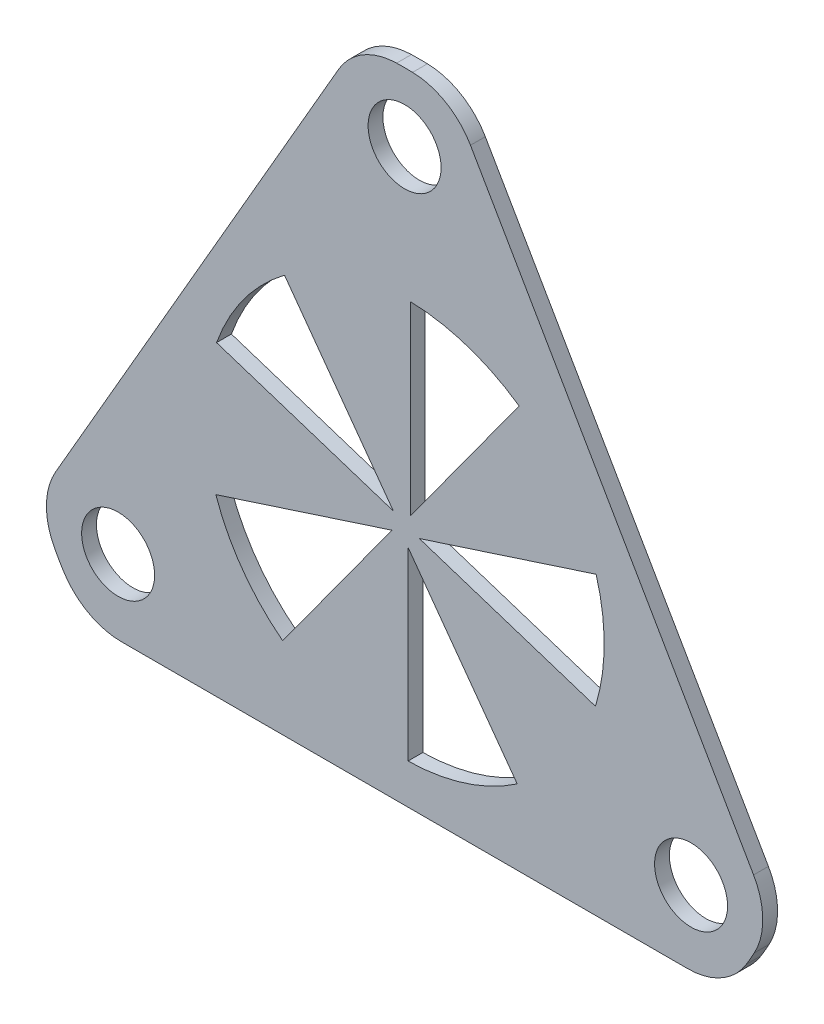
ISO-10303-21;
HEADER;
FILE_DESCRIPTION(('STEP AP214'),'2;1');
FILE_NAME('part.step','',(''),(''),'','','');
FILE_SCHEMA(('AUTOMOTIVE_DESIGN { 1 0 10303 214 1 1 1 1 }'));
ENDSEC;
DATA;
#1=APPLICATION_CONTEXT('core data for automotive mechanical design processes');
#2=APPLICATION_PROTOCOL_DEFINITION('international standard','automotive_design',2000,#1);
#3=PRODUCT_CONTEXT('',#1,'mechanical');
#4=PRODUCT('Part','Part','',(#3));
#5=PRODUCT_RELATED_PRODUCT_CATEGORY('part','',(#4));
#6=PRODUCT_DEFINITION_FORMATION('','',#4);
#7=PRODUCT_DEFINITION_CONTEXT('part definition',#1,'design');
#8=PRODUCT_DEFINITION('design','',#6,#7);
#9=PRODUCT_DEFINITION_SHAPE('','',#8);
#10=(LENGTH_UNIT() NAMED_UNIT(*) SI_UNIT(.MILLI.,.METRE.));
#11=(NAMED_UNIT(*) PLANE_ANGLE_UNIT() SI_UNIT($,.RADIAN.));
#12=(NAMED_UNIT(*) SI_UNIT($,.STERADIAN.) SOLID_ANGLE_UNIT());
#13=UNCERTAINTY_MEASURE_WITH_UNIT(LENGTH_MEASURE(1.E-05),#10,'distance_accuracy_value','');
#14=(GEOMETRIC_REPRESENTATION_CONTEXT(3) GLOBAL_UNCERTAINTY_ASSIGNED_CONTEXT((#13)) GLOBAL_UNIT_ASSIGNED_CONTEXT((#10,
#11,#12)) REPRESENTATION_CONTEXT('',''));
#15=CARTESIAN_POINT('',(0.,0.,0.));
#16=DIRECTION('',(0.,0.,1.));
#17=DIRECTION('',(1.,0.,0.));
#18=AXIS2_PLACEMENT_3D('',#15,#16,#17);
#19=CARTESIAN_POINT('',(0.,0.,8.7));
#20=DIRECTION('',(0.,0.,1.));
#21=DIRECTION('',(1.,0.,0.));
#22=AXIS2_PLACEMENT_3D('',#19,#20,#21);
#23=PLANE('',#22);
#24=CARTESIAN_POINT('',(0.,29.,8.7));
#25=DIRECTION('',(0.,0.,-1.));
#26=DIRECTION('',(-1.,0.,0.));
#27=AXIS2_PLACEMENT_3D('',#24,#25,#26);
#28=CIRCLE('',#27,3.2);
#29=CARTESIAN_POINT('',(-3.2,29.,8.7));
#30=VERTEX_POINT('',#29);
#31=EDGE_CURVE('E399',#30,#30,#28,.T.);
#32=ORIENTED_EDGE('',*,*,#31,.F.);
#33=EDGE_LOOP('',(#32));
#34=FACE_BOUND('',#33,.T.);
#35=CARTESIAN_POINT('',(-25.1147367097503,-14.4999999999991,8.7));
#36=DIRECTION('',(0.,0.,-1.));
#37=DIRECTION('',(-1.,0.,0.));
#38=AXIS2_PLACEMENT_3D('',#35,#36,#37);
#39=CIRCLE('',#38,3.2);
#40=CARTESIAN_POINT('',(-28.3147367097503,-14.4999999999991,8.7));
#41=VERTEX_POINT('',#40);
#42=EDGE_CURVE('E913',#41,#41,#39,.T.);
#43=ORIENTED_EDGE('',*,*,#42,.F.);
#44=EDGE_LOOP('',(#43));
#45=FACE_BOUND('',#44,.T.);
#46=CARTESIAN_POINT('',(25.1147367097471,-14.5000000000009,8.7));
#47=DIRECTION('',(0.,0.,-1.));
#48=DIRECTION('',(-1.,0.,0.));
#49=AXIS2_PLACEMENT_3D('',#46,#47,#48);
#50=CIRCLE('',#49,3.2);
#51=CARTESIAN_POINT('',(21.9147367097471,-14.5000000000009,8.7));
#52=VERTEX_POINT('',#51);
#53=EDGE_CURVE('E416',#52,#52,#50,.T.);
#54=ORIENTED_EDGE('',*,*,#53,.F.);
#55=EDGE_LOOP('',(#54));
#56=FACE_BOUND('',#55,.T.);
#57=DIRECTION('',(-0.587785252292473,-0.809016994374947,0.));
#58=VECTOR('',#57,1.);
#59=CARTESIAN_POINT('',(-0.242705098312483,0.176335575687741,8.7));
#60=LINE('',#59,#58);
#61=CARTESIAN_POINT('',(10.0420252579527,14.3320524949722,8.7));
#62=VERTEX_POINT('',#61);
#63=CARTESIAN_POINT('',(0.5,1.19858144524681,8.7));
#64=VERTEX_POINT('',#63);
#65=EDGE_CURVE('E276',#62,#64,#60,.T.);
#66=ORIENTED_EDGE('',*,*,#65,.F.);
#67=CARTESIAN_POINT('',(0.,0.,8.7));
#68=DIRECTION('',(0.,0.,1.));
#69=DIRECTION('',(1.,0.,0.));
#70=AXIS2_PLACEMENT_3D('',#67,#68,#69);
#71=CIRCLE('',#70,17.5);
#72=CARTESIAN_POINT('',(0.5,17.4928556845359,8.7));
#73=VERTEX_POINT('',#72);
#74=EDGE_CURVE('E230',#62,#73,#71,.T.);
#75=ORIENTED_EDGE('',*,*,#74,.T.);
#76=DIRECTION('',(0.,1.,0.));
#77=VECTOR('',#76,1.);
#78=CARTESIAN_POINT('',(0.5,0.,8.7));
#79=LINE('',#78,#77);
#80=EDGE_CURVE('E279',#64,#73,#79,.T.);
#81=ORIENTED_EDGE('',*,*,#80,.F.);
#82=EDGE_LOOP('',(#66,#75,#81));
#83=FACE_BOUND('',#82,.T.);
#84=CARTESIAN_POINT('',(0.,0.,8.7));
#85=DIRECTION('',(0.,0.,1.));
#86=DIRECTION('',(1.,0.,0.));
#87=AXIS2_PLACEMENT_3D('',#84,#85,#86);
#88=CIRCLE('',#87,17.5);
#89=CARTESIAN_POINT('',(16.7337483798774,-5.12168577315618,8.7));
#90=VERTEX_POINT('',#89);
#91=CARTESIAN_POINT('',(16.7912028845761,4.93006142852242,8.7));
#92=VERTEX_POINT('',#91);
#93=EDGE_CURVE('E268',#90,#92,#88,.T.);
#94=ORIENTED_EDGE('',*,*,#93,.T.);
#95=DIRECTION('',(0.951056516295154,0.309016994374948,0.));
#96=VECTOR('',#95,1.);
#97=CARTESIAN_POINT('',(0.154508497187474,-0.475528258147577,8.7));
#98=LINE('',#97,#96);
#99=CARTESIAN_POINT('',(1.29442719099992,-0.105146222423827,8.7));
#100=VERTEX_POINT('',#99);
#101=EDGE_CURVE('E273',#100,#92,#98,.T.);
#102=ORIENTED_EDGE('',*,*,#101,.F.);
#103=DIRECTION('',(-0.951056516295154,0.309016994374948,0.));
#104=VECTOR('',#103,1.);
#105=CARTESIAN_POINT('',(0.0927050983124842,0.285316954888546,8.7));
#106=LINE('',#105,#104);
#107=EDGE_CURVE('E270',#90,#100,#106,.T.);
#108=ORIENTED_EDGE('',*,*,#107,.F.);
#109=EDGE_LOOP('',(#94,#102,#108));
#110=FACE_BOUND('',#109,.T.);
#111=DIRECTION('',(0.587785252292473,-0.809016994374947,0.));
#112=VECTOR('',#111,1.);
#113=CARTESIAN_POINT('',(-0.242705098312484,-0.176335575687742,8.7));
#114=LINE('',#113,#112);
#115=CARTESIAN_POINT('',(-10.5274354545777,13.9793813435967,8.7));
#116=VERTEX_POINT('',#115);
#117=CARTESIAN_POINT('',(-0.985410196624968,0.845910293871327,8.7));
#118=VERTEX_POINT('',#117);
#119=EDGE_CURVE('E260',#116,#118,#114,.T.);
#120=ORIENTED_EDGE('',*,*,#119,.F.);
#121=CARTESIAN_POINT('',(0.,0.,8.7));
#122=DIRECTION('',(0.,0.,1.));
#123=DIRECTION('',(1.,0.,0.));
#124=AXIS2_PLACEMENT_3D('',#121,#122,#123);
#125=CIRCLE('',#124,17.5);
#126=CARTESIAN_POINT('',(-16.4821858902011,5.88111794481757,8.7));
#127=VERTEX_POINT('',#126);
#128=EDGE_CURVE('E266',#116,#127,#125,.T.);
#129=ORIENTED_EDGE('',*,*,#128,.T.);
#130=DIRECTION('',(-0.951056516295154,0.309016994374947,0.));
#131=VECTOR('',#130,1.);
#132=CARTESIAN_POINT('',(0.154508497187474,0.475528258147577,8.7));
#133=LINE('',#132,#131);
#134=EDGE_CURVE('E263',#118,#127,#133,.T.);
#135=ORIENTED_EDGE('',*,*,#134,.F.);
#136=EDGE_LOOP('',(#120,#129,#135));
#137=FACE_BOUND('',#136,.T.);
#138=DIRECTION('',(0.951056516295154,0.309016994374948,0.));
#139=VECTOR('',#138,1.);
#140=CARTESIAN_POINT('',(0.0927050983124842,-0.285316954888546,8.7));
#141=LINE('',#140,#139);
#142=CARTESIAN_POINT('',(-16.5483381832524,-5.69231968293326,8.7));
#143=VERTEX_POINT('',#142);
#144=CARTESIAN_POINT('',(-1.10901699437495,-0.675780132200919,8.7));
#145=VERTEX_POINT('',#144);
#146=EDGE_CURVE('E252',#143,#145,#141,.T.);
#147=ORIENTED_EDGE('',*,*,#146,.F.);
#148=CARTESIAN_POINT('',(0.,0.,8.7));
#149=DIRECTION('',(0.,0.,1.));
#150=DIRECTION('',(1.,0.,0.));
#151=AXIS2_PLACEMENT_3D('',#148,#149,#150);
#152=CIRCLE('',#151,17.5);
#153=CARTESIAN_POINT('',(-10.6865510890382,-13.8581249027917,8.7));
#154=VERTEX_POINT('',#153);
#155=EDGE_CURVE('E258',#143,#154,#152,.T.);
#156=ORIENTED_EDGE('',*,*,#155,.T.);
#157=DIRECTION('',(-0.587785252292473,-0.809016994374948,0.));
#158=VECTOR('',#157,1.);
#159=CARTESIAN_POINT('',(-0.404508497187474,0.293892626146237,8.7));
#160=LINE('',#159,#158);
#161=EDGE_CURVE('E255',#145,#154,#160,.T.);
#162=ORIENTED_EDGE('',*,*,#161,.F.);
#163=EDGE_LOOP('',(#147,#156,#162));
#164=FACE_BOUND('',#163,.T.);
#165=DIRECTION('',(0.,1.,0.));
#166=VECTOR('',#165,1.);
#167=CARTESIAN_POINT('',(0.3,0.,8.7));
#168=LINE('',#167,#166);
#169=CARTESIAN_POINT('',(0.299999999999999,-17.4974283824795,8.7));
#170=VERTEX_POINT('',#169);
#171=CARTESIAN_POINT('',(0.3,-1.26356538449339,8.7));
#172=VERTEX_POINT('',#171);
#173=EDGE_CURVE('E235',#170,#172,#168,.T.);
#174=ORIENTED_EDGE('',*,*,#173,.F.);
#175=CARTESIAN_POINT('',(0.,0.,8.7));
#176=DIRECTION('',(0.,0.,1.));
#177=DIRECTION('',(1.,0.,0.));
#178=AXIS2_PLACEMENT_3D('',#175,#176,#177);
#179=CIRCLE('',#178,17.5);
#180=CARTESIAN_POINT('',(9.87753409466329,-14.4459101550842,8.7));
#181=VERTEX_POINT('',#180);
#182=EDGE_CURVE('E237',#170,#181,#179,.T.);
#183=ORIENTED_EDGE('',*,*,#182,.T.);
#184=DIRECTION('',(0.587785252292473,-0.809016994374947,0.));
#185=VECTOR('',#184,1.);
#186=CARTESIAN_POINT('',(-0.404508497187474,-0.293892626146237,8.7));
#187=LINE('',#186,#185);
#188=EDGE_CURVE('E222',#172,#181,#187,.T.);
#189=ORIENTED_EDGE('',*,*,#188,.F.);
#190=EDGE_LOOP('',(#174,#183,#189));
#191=FACE_BOUND('',#190,.T.);
#192=CARTESIAN_POINT('',(0.,0.,8.7));
#193=DIRECTION('',(0.,0.,-1.));
#194=DIRECTION('',(-1.,0.,0.));
#195=AXIS2_PLACEMENT_3D('',#192,#193,#194);
#196=CIRCLE('',#195,35.);
#197=CARTESIAN_POINT('',(-29.9543846627366,-18.1034482758621,8.7));
#198=VERTEX_POINT('',#197);
#199=CARTESIAN_POINT('',(-30.6552384343624,-16.8895339347298,8.7));
#200=VERTEX_POINT('',#199);
#201=EDGE_CURVE('E428',#198,#200,#196,.T.);
#202=ORIENTED_EDGE('',*,*,#201,.T.);
#203=CARTESIAN_POINT('',(-25.4000547027574,-13.9941852602047,8.7));
#204=DIRECTION('',(0.,0.,1.));
#205=DIRECTION('',(1.,0.,0.));
#206=AXIS2_PLACEMENT_3D('',#203,#204,#205);
#207=CIRCLE('',#206,6.);
#208=CARTESIAN_POINT('',(-30.5962071254641,-10.9941852602047,8.7));
#209=VERTEX_POINT('',#208);
#210=EDGE_CURVE('E364',#200,#209,#207,.F.);
#211=ORIENTED_EDGE('',*,*,#210,.T.);
#212=DIRECTION('',(0.5,0.866025403784439,0.));
#213=VECTOR('',#212,1.);
#214=CARTESIAN_POINT('',(-36.3730669589464,-21.,8.7));
#215=LINE('',#214,#213);
#216=CARTESIAN_POINT('',(-5.77685983348236,31.9941852602047,8.7));
#217=VERTEX_POINT('',#216);
#218=EDGE_CURVE('E404',#209,#217,#215,.T.);
#219=ORIENTED_EDGE('',*,*,#218,.T.);
#220=CARTESIAN_POINT('',(-0.580707410775721,28.9941852602047,8.7));
#221=DIRECTION('',(0.,0.,1.));
#222=DIRECTION('',(1.,0.,0.));
#223=AXIS2_PLACEMENT_3D('',#220,#221,#222);
#224=CIRCLE('',#223,6.);
#225=CARTESIAN_POINT('',(-0.700853771625869,34.9929822105919,8.7));
#226=VERTEX_POINT('',#225);
#227=EDGE_CURVE('E356',#217,#226,#224,.F.);
#228=ORIENTED_EDGE('',*,*,#227,.T.);
#229=CARTESIAN_POINT('',(0.700853771625863,34.9929822105919,8.7));
#230=VERTEX_POINT('',#229);
#231=EDGE_CURVE('E436',#226,#230,#196,.T.);
#232=ORIENTED_EDGE('',*,*,#231,.T.);
#233=CARTESIAN_POINT('',(0.580707410775715,28.9941852602047,8.7));
#234=DIRECTION('',(0.,0.,1.));
#235=DIRECTION('',(1.,0.,0.));
#236=AXIS2_PLACEMENT_3D('',#233,#234,#235);
#237=CIRCLE('',#236,6.);
#238=CARTESIAN_POINT('',(5.77685983348235,31.9941852602047,8.7));
#239=VERTEX_POINT('',#238);
#240=EDGE_CURVE('E354',#230,#239,#237,.F.);
#241=ORIENTED_EDGE('',*,*,#240,.T.);
#242=DIRECTION('',(0.5,-0.866025403784439,0.));
#243=VECTOR('',#242,1.);
#244=CARTESIAN_POINT('',(0.,42.,8.7));
#245=LINE('',#244,#243);
#246=CARTESIAN_POINT('',(30.5962071254641,-10.9941852602047,8.7));
#247=VERTEX_POINT('',#246);
#248=EDGE_CURVE('E408',#239,#247,#245,.T.);
#249=ORIENTED_EDGE('',*,*,#248,.T.);
#250=CARTESIAN_POINT('',(25.4000547027574,-13.9941852602047,8.7));
#251=DIRECTION('',(0.,0.,1.));
#252=DIRECTION('',(1.,0.,0.));
#253=AXIS2_PLACEMENT_3D('',#250,#251,#252);
#254=CIRCLE('',#253,6.);
#255=CARTESIAN_POINT('',(30.6552384343624,-16.8895339347298,8.7));
#256=VERTEX_POINT('',#255);
#257=EDGE_CURVE('E358',#247,#256,#254,.F.);
#258=ORIENTED_EDGE('',*,*,#257,.T.);
#259=CARTESIAN_POINT('',(29.9543846627366,-18.1034482758621,8.7));
#260=VERTEX_POINT('',#259);
#261=EDGE_CURVE('E248',#256,#260,#196,.T.);
#262=ORIENTED_EDGE('',*,*,#261,.T.);
#263=CARTESIAN_POINT('',(24.8193472919817,-15.,8.7));
#264=DIRECTION('',(0.,0.,1.));
#265=DIRECTION('',(1.,0.,0.));
#266=AXIS2_PLACEMENT_3D('',#263,#264,#265);
#267=CIRCLE('',#266,6.);
#268=CARTESIAN_POINT('',(24.8193472919817,-21.,8.7));
#269=VERTEX_POINT('',#268);
#270=EDGE_CURVE('E360',#260,#269,#267,.F.);
#271=ORIENTED_EDGE('',*,*,#270,.T.);
#272=DIRECTION('',(-1.,0.,0.));
#273=VECTOR('',#272,1.);
#274=CARTESIAN_POINT('',(36.3730669589464,-21.,8.7));
#275=LINE('',#274,#273);
#276=CARTESIAN_POINT('',(-24.8193472919817,-21.,8.7));
#277=VERTEX_POINT('',#276);
#278=EDGE_CURVE('E413',#269,#277,#275,.T.);
#279=ORIENTED_EDGE('',*,*,#278,.T.);
#280=CARTESIAN_POINT('',(-24.8193472919817,-15.,8.7));
#281=DIRECTION('',(0.,0.,1.));
#282=DIRECTION('',(1.,0.,0.));
#283=AXIS2_PLACEMENT_3D('',#280,#281,#282);
#284=CIRCLE('',#283,6.);
#285=EDGE_CURVE('E362',#277,#198,#284,.F.);
#286=ORIENTED_EDGE('',*,*,#285,.T.);
#287=EDGE_LOOP('',(#202,#211,#219,#228,#232,#241,#249,#258,#262,#271,#279,#286));
#288=FACE_BOUND('',#287,.T.);
#289=ADVANCED_FACE('F37',(#34,#45,#56,#83,#110,#137,#164,#191,#288),#23,.F.);
#290=CARTESIAN_POINT('',(0.,0.,10.));
#291=DIRECTION('',(0.,0.,1.));
#292=DIRECTION('',(1.,0.,0.));
#293=AXIS2_PLACEMENT_3D('',#290,#291,#292);
#294=PLANE('',#293);
#295=CARTESIAN_POINT('',(0.,29.,10.));
#296=DIRECTION('',(0.,0.,1.));
#297=DIRECTION('',(1.,0.,0.));
#298=AXIS2_PLACEMENT_3D('',#295,#296,#297);
#299=CIRCLE('',#298,3.2);
#300=CARTESIAN_POINT('',(3.2,29.,10.));
#301=VERTEX_POINT('',#300);
#302=EDGE_CURVE('E41',#301,#301,#299,.T.);
#303=ORIENTED_EDGE('',*,*,#302,.F.);
#304=EDGE_LOOP('',(#303));
#305=FACE_BOUND('',#304,.T.);
#306=CARTESIAN_POINT('',(-25.1147367097503,-14.4999999999991,10.));
#307=DIRECTION('',(0.,0.,1.));
#308=DIRECTION('',(1.,0.,0.));
#309=AXIS2_PLACEMENT_3D('',#306,#307,#308);
#310=CIRCLE('',#309,3.2);
#311=CARTESIAN_POINT('',(-21.9147367097503,-14.4999999999991,10.));
#312=VERTEX_POINT('',#311);
#313=EDGE_CURVE('E398',#312,#312,#310,.T.);
#314=ORIENTED_EDGE('',*,*,#313,.F.);
#315=EDGE_LOOP('',(#314));
#316=FACE_BOUND('',#315,.T.);
#317=CARTESIAN_POINT('',(25.1147367097471,-14.5000000000009,10.));
#318=DIRECTION('',(0.,0.,1.));
#319=DIRECTION('',(1.,0.,0.));
#320=AXIS2_PLACEMENT_3D('',#317,#318,#319);
#321=CIRCLE('',#320,3.2);
#322=CARTESIAN_POINT('',(28.3147367097471,-14.5000000000009,10.));
#323=VERTEX_POINT('',#322);
#324=EDGE_CURVE('E396',#323,#323,#321,.T.);
#325=ORIENTED_EDGE('',*,*,#324,.F.);
#326=EDGE_LOOP('',(#325));
#327=FACE_BOUND('',#326,.T.);
#328=DIRECTION('',(0.,1.,0.));
#329=VECTOR('',#328,1.);
#330=CARTESIAN_POINT('',(0.3,0.,10.));
#331=LINE('',#330,#329);
#332=CARTESIAN_POINT('',(0.299999999999999,-17.4974283824795,10.));
#333=VERTEX_POINT('',#332);
#334=CARTESIAN_POINT('',(0.3,-1.26356538449339,10.));
#335=VERTEX_POINT('',#334);
#336=EDGE_CURVE('E283',#333,#335,#331,.T.);
#337=ORIENTED_EDGE('',*,*,#336,.T.);
#338=DIRECTION('',(0.587785252292473,-0.809016994374947,0.));
#339=VECTOR('',#338,1.);
#340=CARTESIAN_POINT('',(-0.404508497187474,-0.293892626146237,10.));
#341=LINE('',#340,#339);
#342=CARTESIAN_POINT('',(9.87753409466329,-14.4459101550842,10.));
#343=VERTEX_POINT('',#342);
#344=EDGE_CURVE('E224',#335,#343,#341,.T.);
#345=ORIENTED_EDGE('',*,*,#344,.T.);
#346=CARTESIAN_POINT('',(0.,0.,10.));
#347=DIRECTION('',(0.,0.,1.));
#348=DIRECTION('',(1.,0.,0.));
#349=AXIS2_PLACEMENT_3D('',#346,#347,#348);
#350=CIRCLE('',#349,17.5);
#351=EDGE_CURVE('E287',#333,#343,#350,.T.);
#352=ORIENTED_EDGE('',*,*,#351,.F.);
#353=EDGE_LOOP('',(#337,#345,#352));
#354=FACE_BOUND('',#353,.T.);
#355=DIRECTION('',(0.951056516295154,0.309016994374948,0.));
#356=VECTOR('',#355,1.);
#357=CARTESIAN_POINT('',(0.0927050983124842,-0.285316954888546,10.));
#358=LINE('',#357,#356);
#359=CARTESIAN_POINT('',(-16.5483381832524,-5.69231968293326,10.));
#360=VERTEX_POINT('',#359);
#361=CARTESIAN_POINT('',(-1.10901699437495,-0.675780132200919,10.));
#362=VERTEX_POINT('',#361);
#363=EDGE_CURVE('E290',#360,#362,#358,.T.);
#364=ORIENTED_EDGE('',*,*,#363,.T.);
#365=DIRECTION('',(-0.587785252292473,-0.809016994374948,0.));
#366=VECTOR('',#365,1.);
#367=CARTESIAN_POINT('',(-0.404508497187474,0.293892626146237,10.));
#368=LINE('',#367,#366);
#369=CARTESIAN_POINT('',(-10.6865510890382,-13.8581249027917,10.));
#370=VERTEX_POINT('',#369);
#371=EDGE_CURVE('E293',#362,#370,#368,.T.);
#372=ORIENTED_EDGE('',*,*,#371,.T.);
#373=CARTESIAN_POINT('',(0.,0.,10.));
#374=DIRECTION('',(0.,0.,1.));
#375=DIRECTION('',(1.,0.,0.));
#376=AXIS2_PLACEMENT_3D('',#373,#374,#375);
#377=CIRCLE('',#376,17.5);
#378=EDGE_CURVE('E296',#360,#370,#377,.T.);
#379=ORIENTED_EDGE('',*,*,#378,.F.);
#380=EDGE_LOOP('',(#364,#372,#379));
#381=FACE_BOUND('',#380,.T.);
#382=DIRECTION('',(0.587785252292473,-0.809016994374947,0.));
#383=VECTOR('',#382,1.);
#384=CARTESIAN_POINT('',(-0.242705098312484,-0.176335575687742,10.));
#385=LINE('',#384,#383);
#386=CARTESIAN_POINT('',(-10.5274354545777,13.9793813435967,10.));
#387=VERTEX_POINT('',#386);
#388=CARTESIAN_POINT('',(-0.985410196624968,0.845910293871327,10.));
#389=VERTEX_POINT('',#388);
#390=EDGE_CURVE('E299',#387,#389,#385,.T.);
#391=ORIENTED_EDGE('',*,*,#390,.T.);
#392=DIRECTION('',(-0.951056516295154,0.309016994374947,0.));
#393=VECTOR('',#392,1.);
#394=CARTESIAN_POINT('',(0.154508497187474,0.475528258147577,10.));
#395=LINE('',#394,#393);
#396=CARTESIAN_POINT('',(-16.4821858902011,5.88111794481757,10.));
#397=VERTEX_POINT('',#396);
#398=EDGE_CURVE('E302',#389,#397,#395,.T.);
#399=ORIENTED_EDGE('',*,*,#398,.T.);
#400=CARTESIAN_POINT('',(0.,0.,10.));
#401=DIRECTION('',(0.,0.,1.));
#402=DIRECTION('',(1.,0.,0.));
#403=AXIS2_PLACEMENT_3D('',#400,#401,#402);
#404=CIRCLE('',#403,17.5);
#405=EDGE_CURVE('E305',#387,#397,#404,.T.);
#406=ORIENTED_EDGE('',*,*,#405,.F.);
#407=EDGE_LOOP('',(#391,#399,#406));
#408=FACE_BOUND('',#407,.T.);
#409=CARTESIAN_POINT('',(0.,0.,10.));
#410=DIRECTION('',(0.,0.,1.));
#411=DIRECTION('',(1.,0.,0.));
#412=AXIS2_PLACEMENT_3D('',#409,#410,#411);
#413=CIRCLE('',#412,17.5);
#414=CARTESIAN_POINT('',(16.7337483798774,-5.12168577315618,10.));
#415=VERTEX_POINT('',#414);
#416=CARTESIAN_POINT('',(16.7912028845761,4.93006142852242,10.));
#417=VERTEX_POINT('',#416);
#418=EDGE_CURVE('E308',#415,#417,#413,.T.);
#419=ORIENTED_EDGE('',*,*,#418,.F.);
#420=DIRECTION('',(-0.951056516295154,0.309016994374948,0.));
#421=VECTOR('',#420,1.);
#422=CARTESIAN_POINT('',(0.0927050983124842,0.285316954888546,10.));
#423=LINE('',#422,#421);
#424=CARTESIAN_POINT('',(1.29442719099992,-0.105146222423827,10.));
#425=VERTEX_POINT('',#424);
#426=EDGE_CURVE('E311',#415,#425,#423,.T.);
#427=ORIENTED_EDGE('',*,*,#426,.T.);
#428=DIRECTION('',(0.951056516295154,0.309016994374948,0.));
#429=VECTOR('',#428,1.);
#430=CARTESIAN_POINT('',(0.154508497187474,-0.475528258147577,10.));
#431=LINE('',#430,#429);
#432=EDGE_CURVE('E314',#425,#417,#431,.T.);
#433=ORIENTED_EDGE('',*,*,#432,.T.);
#434=EDGE_LOOP('',(#419,#427,#433));
#435=FACE_BOUND('',#434,.T.);
#436=DIRECTION('',(-0.587785252292473,-0.809016994374947,0.));
#437=VECTOR('',#436,1.);
#438=CARTESIAN_POINT('',(-0.242705098312483,0.176335575687741,10.));
#439=LINE('',#438,#437);
#440=CARTESIAN_POINT('',(10.0420252579527,14.3320524949722,10.));
#441=VERTEX_POINT('',#440);
#442=CARTESIAN_POINT('',(0.5,1.19858144524681,10.));
#443=VERTEX_POINT('',#442);
#444=EDGE_CURVE('E317',#441,#443,#439,.T.);
#445=ORIENTED_EDGE('',*,*,#444,.T.);
#446=DIRECTION('',(0.,1.,0.));
#447=VECTOR('',#446,1.);
#448=CARTESIAN_POINT('',(0.5,0.,10.));
#449=LINE('',#448,#447);
#450=CARTESIAN_POINT('',(0.5,17.4928556845359,10.));
#451=VERTEX_POINT('',#450);
#452=EDGE_CURVE('E245',#443,#451,#449,.T.);
#453=ORIENTED_EDGE('',*,*,#452,.T.);
#454=CARTESIAN_POINT('',(0.,0.,10.));
#455=DIRECTION('',(0.,0.,1.));
#456=DIRECTION('',(1.,0.,0.));
#457=AXIS2_PLACEMENT_3D('',#454,#455,#456);
#458=CIRCLE('',#457,17.5);
#459=EDGE_CURVE('E242',#441,#451,#458,.T.);
#460=ORIENTED_EDGE('',*,*,#459,.F.);
#461=EDGE_LOOP('',(#445,#453,#460));
#462=FACE_BOUND('',#461,.T.);
#463=DIRECTION('',(-0.5,-0.866025403784439,0.));
#464=VECTOR('',#463,1.);
#465=CARTESIAN_POINT('',(-18.1865334794732,10.5,10.));
#466=LINE('',#465,#464);
#467=CARTESIAN_POINT('',(-5.77685983348236,31.9941852602047,10.));
#468=VERTEX_POINT('',#467);
#469=CARTESIAN_POINT('',(-30.5962071254641,-10.9941852602047,10.));
#470=VERTEX_POINT('',#469);
#471=EDGE_CURVE('E426',#468,#470,#466,.T.);
#472=ORIENTED_EDGE('',*,*,#471,.T.);
#473=CARTESIAN_POINT('',(-25.4000547027574,-13.9941852602047,10.));
#474=DIRECTION('',(0.,0.,1.));
#475=DIRECTION('',(1.,0.,0.));
#476=AXIS2_PLACEMENT_3D('',#473,#474,#475);
#477=CIRCLE('',#476,6.);
#478=CARTESIAN_POINT('',(-30.6552384343624,-16.8895339347298,10.));
#479=VERTEX_POINT('',#478);
#480=EDGE_CURVE('E379',#470,#479,#477,.T.);
#481=ORIENTED_EDGE('',*,*,#480,.T.);
#482=CARTESIAN_POINT('',(0.,0.,10.));
#483=DIRECTION('',(0.,0.,-1.));
#484=DIRECTION('',(-1.,0.,0.));
#485=AXIS2_PLACEMENT_3D('',#482,#483,#484);
#486=CIRCLE('',#485,35.);
#487=CARTESIAN_POINT('',(-29.9543846627366,-18.1034482758621,10.));
#488=VERTEX_POINT('',#487);
#489=EDGE_CURVE('E431',#488,#479,#486,.T.);
#490=ORIENTED_EDGE('',*,*,#489,.F.);
#491=CARTESIAN_POINT('',(-24.8193472919817,-15.,10.));
#492=DIRECTION('',(0.,0.,1.));
#493=DIRECTION('',(1.,0.,0.));
#494=AXIS2_PLACEMENT_3D('',#491,#492,#493);
#495=CIRCLE('',#494,6.);
#496=CARTESIAN_POINT('',(-24.8193472919817,-21.,10.));
#497=VERTEX_POINT('',#496);
#498=EDGE_CURVE('E377',#488,#497,#495,.T.);
#499=ORIENTED_EDGE('',*,*,#498,.T.);
#500=DIRECTION('',(1.,0.,0.));
#501=VECTOR('',#500,1.);
#502=CARTESIAN_POINT('',(0.,-21.,10.));
#503=LINE('',#502,#501);
#504=CARTESIAN_POINT('',(24.8193472919817,-21.,10.));
#505=VERTEX_POINT('',#504);
#506=EDGE_CURVE('E423',#497,#505,#503,.T.);
#507=ORIENTED_EDGE('',*,*,#506,.T.);
#508=CARTESIAN_POINT('',(24.8193472919817,-15.,10.));
#509=DIRECTION('',(0.,0.,1.));
#510=DIRECTION('',(1.,0.,0.));
#511=AXIS2_PLACEMENT_3D('',#508,#509,#510);
#512=CIRCLE('',#511,6.);
#513=CARTESIAN_POINT('',(29.9543846627366,-18.1034482758621,10.));
#514=VERTEX_POINT('',#513);
#515=EDGE_CURVE('E375',#505,#514,#512,.T.);
#516=ORIENTED_EDGE('',*,*,#515,.T.);
#517=CARTESIAN_POINT('',(30.6552384343624,-16.8895339347298,10.));
#518=VERTEX_POINT('',#517);
#519=EDGE_CURVE('E429',#518,#514,#486,.T.);
#520=ORIENTED_EDGE('',*,*,#519,.F.);
#521=CARTESIAN_POINT('',(25.4000547027574,-13.9941852602047,10.));
#522=DIRECTION('',(0.,0.,1.));
#523=DIRECTION('',(1.,0.,0.));
#524=AXIS2_PLACEMENT_3D('',#521,#522,#523);
#525=CIRCLE('',#524,6.);
#526=CARTESIAN_POINT('',(30.5962071254641,-10.9941852602047,10.));
#527=VERTEX_POINT('',#526);
#528=EDGE_CURVE('E61',#518,#527,#525,.T.);
#529=ORIENTED_EDGE('',*,*,#528,.T.);
#530=DIRECTION('',(-0.5,0.866025403784439,0.));
#531=VECTOR('',#530,1.);
#532=CARTESIAN_POINT('',(18.1865334794732,10.5,10.));
#533=LINE('',#532,#531);
#534=CARTESIAN_POINT('',(5.77685983348235,31.9941852602047,10.));
#535=VERTEX_POINT('',#534);
#536=EDGE_CURVE('E421',#527,#535,#533,.T.);
#537=ORIENTED_EDGE('',*,*,#536,.T.);
#538=CARTESIAN_POINT('',(0.580707410775715,28.9941852602047,10.));
#539=DIRECTION('',(0.,0.,1.));
#540=DIRECTION('',(1.,0.,0.));
#541=AXIS2_PLACEMENT_3D('',#538,#539,#540);
#542=CIRCLE('',#541,6.);
#543=CARTESIAN_POINT('',(0.700853771625863,34.9929822105919,10.));
#544=VERTEX_POINT('',#543);
#545=EDGE_CURVE('E370',#535,#544,#542,.T.);
#546=ORIENTED_EDGE('',*,*,#545,.T.);
#547=CARTESIAN_POINT('',(-0.700853771625869,34.9929822105919,10.));
#548=VERTEX_POINT('',#547);
#549=EDGE_CURVE('E285',#548,#544,#486,.T.);
#550=ORIENTED_EDGE('',*,*,#549,.F.);
#551=CARTESIAN_POINT('',(-0.580707410775721,28.9941852602047,10.));
#552=DIRECTION('',(0.,0.,1.));
#553=DIRECTION('',(1.,0.,0.));
#554=AXIS2_PLACEMENT_3D('',#551,#552,#553);
#555=CIRCLE('',#554,6.);
#556=EDGE_CURVE('E372',#548,#468,#555,.T.);
#557=ORIENTED_EDGE('',*,*,#556,.T.);
#558=EDGE_LOOP('',(#472,#481,#490,#499,#507,#516,#520,#529,#537,#546,#550,#557));
#559=FACE_BOUND('',#558,.T.);
#560=ADVANCED_FACE('F452',(#305,#316,#327,#354,#381,#408,#435,#462,#559),#294,.T.);
#561=CARTESIAN_POINT('',(0.,0.,10.));
#562=DIRECTION('',(0.,0.,-1.));
#563=DIRECTION('',(-1.,0.,0.));
#564=AXIS2_PLACEMENT_3D('',#561,#562,#563);
#565=CYLINDRICAL_SURFACE('',#564,35.);
#566=ORIENTED_EDGE('',*,*,#231,.F.);
#567=DIRECTION('',(0.,0.,-1.));
#568=VECTOR('',#567,1.);
#569=CARTESIAN_POINT('',(-0.70085377162587,34.9929822105919,10.));
#570=LINE('',#569,#568);
#571=EDGE_CURVE('E11',#226,#548,#570,.F.);
#572=ORIENTED_EDGE('',*,*,#571,.T.);
#573=ORIENTED_EDGE('',*,*,#549,.T.);
#574=DIRECTION('',(0.,0.,-1.));
#575=VECTOR('',#574,1.);
#576=CARTESIAN_POINT('',(0.700853771625863,34.9929822105919,10.));
#577=LINE('',#576,#575);
#578=EDGE_CURVE('E46',#544,#230,#577,.T.);
#579=ORIENTED_EDGE('',*,*,#578,.T.);
#580=EDGE_LOOP('',(#566,#572,#573,#579));
#581=FACE_BOUND('',#580,.T.);
#582=ADVANCED_FACE('F473',(#581),#565,.T.);
#583=ORIENTED_EDGE('',*,*,#489,.T.);
#584=DIRECTION('',(0.,0.,-1.));
#585=VECTOR('',#584,1.);
#586=CARTESIAN_POINT('',(-30.6552384343624,-16.8895339347298,10.));
#587=LINE('',#586,#585);
#588=EDGE_CURVE('E351',#479,#200,#587,.T.);
#589=ORIENTED_EDGE('',*,*,#588,.T.);
#590=ORIENTED_EDGE('',*,*,#201,.F.);
#591=DIRECTION('',(0.,0.,-1.));
#592=VECTOR('',#591,1.);
#593=CARTESIAN_POINT('',(-29.9543846627366,-18.1034482758621,10.));
#594=LINE('',#593,#592);
#595=EDGE_CURVE('E324',#198,#488,#594,.F.);
#596=ORIENTED_EDGE('',*,*,#595,.T.);
#597=EDGE_LOOP('',(#583,#589,#590,#596));
#598=FACE_BOUND('',#597,.T.);
#599=ADVANCED_FACE('F447',(#598),#565,.T.);
#600=ORIENTED_EDGE('',*,*,#519,.T.);
#601=DIRECTION('',(0.,0.,-1.));
#602=VECTOR('',#601,1.);
#603=CARTESIAN_POINT('',(29.9543846627366,-18.1034482758621,10.));
#604=LINE('',#603,#602);
#605=EDGE_CURVE('E388',#514,#260,#604,.T.);
#606=ORIENTED_EDGE('',*,*,#605,.T.);
#607=ORIENTED_EDGE('',*,*,#261,.F.);
#608=DIRECTION('',(0.,0.,-1.));
#609=VECTOR('',#608,1.);
#610=CARTESIAN_POINT('',(30.6552384343624,-16.8895339347298,10.));
#611=LINE('',#610,#609);
#612=EDGE_CURVE('E385',#256,#518,#611,.F.);
#613=ORIENTED_EDGE('',*,*,#612,.T.);
#614=EDGE_LOOP('',(#600,#606,#607,#613));
#615=FACE_BOUND('',#614,.T.);
#616=ADVANCED_FACE('F461',(#615),#565,.T.);
#617=CARTESIAN_POINT('',(-0.242705098312483,0.176335575687741,8.7));
#618=DIRECTION('',(-0.809016994374947,0.587785252292473,0.));
#619=DIRECTION('',(-0.587785252292473,-0.809016994374947,0.));
#620=AXIS2_PLACEMENT_3D('',#617,#618,#619);
#621=PLANE('',#620);
#622=ORIENTED_EDGE('',*,*,#444,.F.);
#623=DIRECTION('',(0.,0.,1.));
#624=VECTOR('',#623,1.);
#625=CARTESIAN_POINT('',(10.0420252579527,14.3320524949722,8.7));
#626=LINE('',#625,#624);
#627=EDGE_CURVE('E322',#62,#441,#626,.T.);
#628=ORIENTED_EDGE('',*,*,#627,.F.);
#629=ORIENTED_EDGE('',*,*,#65,.T.);
#630=DIRECTION('',(0.,0.,1.));
#631=VECTOR('',#630,1.);
#632=CARTESIAN_POINT('',(0.5,1.19858144524681,8.7));
#633=LINE('',#632,#631);
#634=EDGE_CURVE('E327',#64,#443,#633,.T.);
#635=ORIENTED_EDGE('',*,*,#634,.T.);
#636=EDGE_LOOP('',(#622,#628,#629,#635));
#637=FACE_BOUND('',#636,.T.);
#638=ADVANCED_FACE('F507',(#637),#621,.T.);
#639=CARTESIAN_POINT('',(0.,0.,8.7));
#640=DIRECTION('',(0.,0.,1.));
#641=DIRECTION('',(1.,0.,0.));
#642=AXIS2_PLACEMENT_3D('',#639,#640,#641);
#643=CYLINDRICAL_SURFACE('',#642,17.5);
#644=ORIENTED_EDGE('',*,*,#459,.T.);
#645=DIRECTION('',(0.,0.,1.));
#646=VECTOR('',#645,1.);
#647=CARTESIAN_POINT('',(0.5,17.4928556845359,8.7));
#648=LINE('',#647,#646);
#649=EDGE_CURVE('E325',#73,#451,#648,.T.);
#650=ORIENTED_EDGE('',*,*,#649,.F.);
#651=ORIENTED_EDGE('',*,*,#74,.F.);
#652=ORIENTED_EDGE('',*,*,#627,.T.);
#653=EDGE_LOOP('',(#644,#650,#651,#652));
#654=FACE_BOUND('',#653,.T.);
#655=ADVANCED_FACE('F503',(#654),#643,.F.);
#656=CARTESIAN_POINT('',(0.,0.,8.7));
#657=DIRECTION('',(0.,0.,1.));
#658=DIRECTION('',(1.,0.,0.));
#659=AXIS2_PLACEMENT_3D('',#656,#657,#658);
#660=CYLINDRICAL_SURFACE('',#659,17.5);
#661=ORIENTED_EDGE('',*,*,#418,.T.);
#662=DIRECTION('',(0.,0.,1.));
#663=VECTOR('',#662,1.);
#664=CARTESIAN_POINT('',(16.7912028845761,4.93006142852242,8.7));
#665=LINE('',#664,#663);
#666=EDGE_CURVE('E329',#92,#417,#665,.T.);
#667=ORIENTED_EDGE('',*,*,#666,.F.);
#668=ORIENTED_EDGE('',*,*,#93,.F.);
#669=DIRECTION('',(0.,0.,1.));
#670=VECTOR('',#669,1.);
#671=CARTESIAN_POINT('',(16.7337483798774,-5.12168577315618,8.7));
#672=LINE('',#671,#670);
#673=EDGE_CURVE('E333',#90,#415,#672,.T.);
#674=ORIENTED_EDGE('',*,*,#673,.T.);
#675=EDGE_LOOP('',(#661,#667,#668,#674));
#676=FACE_BOUND('',#675,.T.);
#677=ADVANCED_FACE('F506',(#676),#660,.F.);
#678=CARTESIAN_POINT('',(0.154508497187474,-0.475528258147577,8.7));
#679=DIRECTION('',(0.309016994374948,-0.951056516295154,0.));
#680=DIRECTION('',(0.951056516295154,0.309016994374948,0.));
#681=AXIS2_PLACEMENT_3D('',#678,#679,#680);
#682=PLANE('',#681);
#683=ORIENTED_EDGE('',*,*,#432,.F.);
#684=DIRECTION('',(0.,0.,1.));
#685=VECTOR('',#684,1.);
#686=CARTESIAN_POINT('',(1.29442719099992,-0.105146222423827,8.7));
#687=LINE('',#686,#685);
#688=EDGE_CURVE('E331',#100,#425,#687,.T.);
#689=ORIENTED_EDGE('',*,*,#688,.F.);
#690=ORIENTED_EDGE('',*,*,#101,.T.);
#691=ORIENTED_EDGE('',*,*,#666,.T.);
#692=EDGE_LOOP('',(#683,#689,#690,#691));
#693=FACE_BOUND('',#692,.T.);
#694=ADVANCED_FACE('F518',(#693),#682,.T.);
#695=CARTESIAN_POINT('',(-0.242705098312484,-0.176335575687742,8.7));
#696=DIRECTION('',(-0.809016994374947,-0.587785252292473,0.));
#697=DIRECTION('',(0.587785252292473,-0.809016994374948,0.));
#698=AXIS2_PLACEMENT_3D('',#695,#696,#697);
#699=PLANE('',#698);
#700=ORIENTED_EDGE('',*,*,#390,.F.);
#701=DIRECTION('',(0.,0.,1.));
#702=VECTOR('',#701,1.);
#703=CARTESIAN_POINT('',(-10.5274354545777,13.9793813435967,8.7));
#704=LINE('',#703,#702);
#705=EDGE_CURVE('E335',#116,#387,#704,.T.);
#706=ORIENTED_EDGE('',*,*,#705,.F.);
#707=ORIENTED_EDGE('',*,*,#119,.T.);
#708=DIRECTION('',(0.,0.,1.));
#709=VECTOR('',#708,1.);
#710=CARTESIAN_POINT('',(-0.985410196624968,0.845910293871327,8.7));
#711=LINE('',#710,#709);
#712=EDGE_CURVE('E339',#118,#389,#711,.T.);
#713=ORIENTED_EDGE('',*,*,#712,.T.);
#714=EDGE_LOOP('',(#700,#706,#707,#713));
#715=FACE_BOUND('',#714,.T.);
#716=ADVANCED_FACE('F521',(#715),#699,.T.);
#717=CARTESIAN_POINT('',(0.,0.,8.7));
#718=DIRECTION('',(0.,0.,1.));
#719=DIRECTION('',(1.,0.,0.));
#720=AXIS2_PLACEMENT_3D('',#717,#718,#719);
#721=CYLINDRICAL_SURFACE('',#720,17.5);
#722=ORIENTED_EDGE('',*,*,#405,.T.);
#723=DIRECTION('',(0.,0.,1.));
#724=VECTOR('',#723,1.);
#725=CARTESIAN_POINT('',(-16.4821858902011,5.88111794481757,8.7));
#726=LINE('',#725,#724);
#727=EDGE_CURVE('E337',#127,#397,#726,.T.);
#728=ORIENTED_EDGE('',*,*,#727,.F.);
#729=ORIENTED_EDGE('',*,*,#128,.F.);
#730=ORIENTED_EDGE('',*,*,#705,.T.);
#731=EDGE_LOOP('',(#722,#728,#729,#730));
#732=FACE_BOUND('',#731,.T.);
#733=ADVANCED_FACE('F530',(#732),#721,.F.);
#734=CARTESIAN_POINT('',(0.0927050983124842,-0.285316954888546,8.7));
#735=DIRECTION('',(0.309016994374948,-0.951056516295154,0.));
#736=DIRECTION('',(0.951056516295154,0.309016994374947,0.));
#737=AXIS2_PLACEMENT_3D('',#734,#735,#736);
#738=PLANE('',#737);
#739=ORIENTED_EDGE('',*,*,#363,.F.);
#740=DIRECTION('',(0.,0.,1.));
#741=VECTOR('',#740,1.);
#742=CARTESIAN_POINT('',(-16.5483381832524,-5.69231968293326,8.7));
#743=LINE('',#742,#741);
#744=EDGE_CURVE('E341',#143,#360,#743,.T.);
#745=ORIENTED_EDGE('',*,*,#744,.F.);
#746=ORIENTED_EDGE('',*,*,#146,.T.);
#747=DIRECTION('',(0.,0.,1.));
#748=VECTOR('',#747,1.);
#749=CARTESIAN_POINT('',(-1.10901699437495,-0.675780132200919,8.7));
#750=LINE('',#749,#748);
#751=EDGE_CURVE('E345',#145,#362,#750,.T.);
#752=ORIENTED_EDGE('',*,*,#751,.T.);
#753=EDGE_LOOP('',(#739,#745,#746,#752));
#754=FACE_BOUND('',#753,.T.);
#755=ADVANCED_FACE('F533',(#754),#738,.T.);
#756=CARTESIAN_POINT('',(0.,0.,8.7));
#757=DIRECTION('',(0.,0.,1.));
#758=DIRECTION('',(1.,0.,0.));
#759=AXIS2_PLACEMENT_3D('',#756,#757,#758);
#760=CYLINDRICAL_SURFACE('',#759,17.5);
#761=ORIENTED_EDGE('',*,*,#378,.T.);
#762=DIRECTION('',(0.,0.,1.));
#763=VECTOR('',#762,1.);
#764=CARTESIAN_POINT('',(-10.6865510890382,-13.8581249027917,8.7));
#765=LINE('',#764,#763);
#766=EDGE_CURVE('E343',#154,#370,#765,.T.);
#767=ORIENTED_EDGE('',*,*,#766,.F.);
#768=ORIENTED_EDGE('',*,*,#155,.F.);
#769=ORIENTED_EDGE('',*,*,#744,.T.);
#770=EDGE_LOOP('',(#761,#767,#768,#769));
#771=FACE_BOUND('',#770,.T.);
#772=ADVANCED_FACE('F542',(#771),#760,.F.);
#773=CARTESIAN_POINT('',(0.3,0.,8.7));
#774=DIRECTION('',(1.,0.,0.));
#775=DIRECTION('',(0.,1.,0.));
#776=AXIS2_PLACEMENT_3D('',#773,#774,#775);
#777=PLANE('',#776);
#778=ORIENTED_EDGE('',*,*,#336,.F.);
#779=DIRECTION('',(0.,0.,1.));
#780=VECTOR('',#779,1.);
#781=CARTESIAN_POINT('',(0.299999999999999,-17.4974283824795,8.7));
#782=LINE('',#781,#780);
#783=EDGE_CURVE('E241',#170,#333,#782,.T.);
#784=ORIENTED_EDGE('',*,*,#783,.F.);
#785=ORIENTED_EDGE('',*,*,#173,.T.);
#786=DIRECTION('',(0.,0.,1.));
#787=VECTOR('',#786,1.);
#788=CARTESIAN_POINT('',(0.3,-1.26356538449339,8.7));
#789=LINE('',#788,#787);
#790=EDGE_CURVE('E219',#172,#335,#789,.T.);
#791=ORIENTED_EDGE('',*,*,#790,.T.);
#792=EDGE_LOOP('',(#778,#784,#785,#791));
#793=FACE_BOUND('',#792,.T.);
#794=ADVANCED_FACE('F240',(#793),#777,.T.);
#795=CARTESIAN_POINT('',(0.,0.,8.7));
#796=DIRECTION('',(0.,0.,1.));
#797=DIRECTION('',(1.,0.,0.));
#798=AXIS2_PLACEMENT_3D('',#795,#796,#797);
#799=CYLINDRICAL_SURFACE('',#798,17.5);
#800=ORIENTED_EDGE('',*,*,#351,.T.);
#801=DIRECTION('',(0.,0.,1.));
#802=VECTOR('',#801,1.);
#803=CARTESIAN_POINT('',(9.87753409466329,-14.4459101550842,8.7));
#804=LINE('',#803,#802);
#805=EDGE_CURVE('E229',#181,#343,#804,.T.);
#806=ORIENTED_EDGE('',*,*,#805,.F.);
#807=ORIENTED_EDGE('',*,*,#182,.F.);
#808=ORIENTED_EDGE('',*,*,#783,.T.);
#809=EDGE_LOOP('',(#800,#806,#807,#808));
#810=FACE_BOUND('',#809,.T.);
#811=ADVANCED_FACE('F513',(#810),#799,.F.);
#812=CARTESIAN_POINT('',(0.5,0.,8.7));
#813=DIRECTION('',(1.,0.,0.));
#814=DIRECTION('',(0.,0.,-1.));
#815=AXIS2_PLACEMENT_3D('',#812,#813,#814);
#816=PLANE('',#815);
#817=ORIENTED_EDGE('',*,*,#452,.F.);
#818=ORIENTED_EDGE('',*,*,#634,.F.);
#819=ORIENTED_EDGE('',*,*,#80,.T.);
#820=ORIENTED_EDGE('',*,*,#649,.T.);
#821=EDGE_LOOP('',(#817,#818,#819,#820));
#822=FACE_BOUND('',#821,.T.);
#823=ADVANCED_FACE('F509',(#822),#816,.T.);
#824=CARTESIAN_POINT('',(0.0927050983124842,0.285316954888546,8.7));
#825=DIRECTION('',(0.309016994374948,0.951056516295154,0.));
#826=DIRECTION('',(-0.951056516295154,0.309016994374948,0.));
#827=AXIS2_PLACEMENT_3D('',#824,#825,#826);
#828=PLANE('',#827);
#829=ORIENTED_EDGE('',*,*,#426,.F.);
#830=ORIENTED_EDGE('',*,*,#673,.F.);
#831=ORIENTED_EDGE('',*,*,#107,.T.);
#832=ORIENTED_EDGE('',*,*,#688,.T.);
#833=EDGE_LOOP('',(#829,#830,#831,#832));
#834=FACE_BOUND('',#833,.T.);
#835=ADVANCED_FACE('F512',(#834),#828,.T.);
#836=CARTESIAN_POINT('',(0.154508497187474,0.475528258147577,8.7));
#837=DIRECTION('',(0.309016994374947,0.951056516295154,0.));
#838=DIRECTION('',(-0.951056516295154,0.309016994374947,0.));
#839=AXIS2_PLACEMENT_3D('',#836,#837,#838);
#840=PLANE('',#839);
#841=ORIENTED_EDGE('',*,*,#398,.F.);
#842=ORIENTED_EDGE('',*,*,#712,.F.);
#843=ORIENTED_EDGE('',*,*,#134,.T.);
#844=ORIENTED_EDGE('',*,*,#727,.T.);
#845=EDGE_LOOP('',(#841,#842,#843,#844));
#846=FACE_BOUND('',#845,.T.);
#847=ADVANCED_FACE('F525',(#846),#840,.T.);
#848=CARTESIAN_POINT('',(-0.404508497187474,0.293892626146237,8.7));
#849=DIRECTION('',(-0.809016994374948,0.587785252292473,0.));
#850=DIRECTION('',(-0.587785252292473,-0.809016994374948,0.));
#851=AXIS2_PLACEMENT_3D('',#848,#849,#850);
#852=PLANE('',#851);
#853=ORIENTED_EDGE('',*,*,#371,.F.);
#854=ORIENTED_EDGE('',*,*,#751,.F.);
#855=ORIENTED_EDGE('',*,*,#161,.T.);
#856=ORIENTED_EDGE('',*,*,#766,.T.);
#857=EDGE_LOOP('',(#853,#854,#855,#856));
#858=FACE_BOUND('',#857,.T.);
#859=ADVANCED_FACE('F537',(#858),#852,.T.);
#860=CARTESIAN_POINT('',(-0.404508497187474,-0.293892626146237,8.7));
#861=DIRECTION('',(-0.809016994374947,-0.587785252292473,0.));
#862=DIRECTION('',(0.587785252292473,-0.809016994374947,0.));
#863=AXIS2_PLACEMENT_3D('',#860,#861,#862);
#864=PLANE('',#863);
#865=ORIENTED_EDGE('',*,*,#344,.F.);
#866=ORIENTED_EDGE('',*,*,#790,.F.);
#867=ORIENTED_EDGE('',*,*,#188,.T.);
#868=ORIENTED_EDGE('',*,*,#805,.T.);
#869=EDGE_LOOP('',(#865,#866,#867,#868));
#870=FACE_BOUND('',#869,.T.);
#871=ADVANCED_FACE('F221',(#870),#864,.T.);
#872=CARTESIAN_POINT('',(0.,42.,18.7));
#873=DIRECTION('',(0.866025403784439,0.5,0.));
#874=DIRECTION('',(-0.5,0.866025403784439,0.));
#875=AXIS2_PLACEMENT_3D('',#872,#873,#874);
#876=PLANE('',#875);
#877=ORIENTED_EDGE('',*,*,#536,.F.);
#878=DIRECTION('',(0.,0.,-1.));
#879=VECTOR('',#878,1.);
#880=CARTESIAN_POINT('',(30.5962071254641,-10.9941852602047,18.7));
#881=LINE('',#880,#879);
#882=EDGE_CURVE('E392',#527,#247,#881,.T.);
#883=ORIENTED_EDGE('',*,*,#882,.T.);
#884=ORIENTED_EDGE('',*,*,#248,.F.);
#885=DIRECTION('',(0.,0.,-1.));
#886=VECTOR('',#885,1.);
#887=CARTESIAN_POINT('',(5.77685983348235,31.9941852602047,18.7));
#888=LINE('',#887,#886);
#889=EDGE_CURVE('E54',#239,#535,#888,.F.);
#890=ORIENTED_EDGE('',*,*,#889,.T.);
#891=EDGE_LOOP('',(#877,#883,#884,#890));
#892=FACE_BOUND('',#891,.T.);
#893=ADVANCED_FACE('F467',(#892),#876,.T.);
#894=CARTESIAN_POINT('',(36.3730669589464,-21.,18.7));
#895=DIRECTION('',(0.,-1.,0.));
#896=DIRECTION('',(1.,0.,0.));
#897=AXIS2_PLACEMENT_3D('',#894,#895,#896);
#898=PLANE('',#897);
#899=ORIENTED_EDGE('',*,*,#506,.F.);
#900=DIRECTION('',(0.,0.,-1.));
#901=VECTOR('',#900,1.);
#902=CARTESIAN_POINT('',(-24.8193472919817,-21.,18.7));
#903=LINE('',#902,#901);
#904=EDGE_CURVE('E383',#497,#277,#903,.T.);
#905=ORIENTED_EDGE('',*,*,#904,.T.);
#906=ORIENTED_EDGE('',*,*,#278,.F.);
#907=DIRECTION('',(0.,0.,-1.));
#908=VECTOR('',#907,1.);
#909=CARTESIAN_POINT('',(24.8193472919817,-21.,18.7));
#910=LINE('',#909,#908);
#911=EDGE_CURVE('E381',#269,#505,#910,.F.);
#912=ORIENTED_EDGE('',*,*,#911,.T.);
#913=EDGE_LOOP('',(#899,#905,#906,#912));
#914=FACE_BOUND('',#913,.T.);
#915=ADVANCED_FACE('F455',(#914),#898,.T.);
#916=CARTESIAN_POINT('',(-36.3730669589464,-21.,18.7));
#917=DIRECTION('',(-0.866025403784439,0.5,0.));
#918=DIRECTION('',(-0.5,-0.866025403784439,0.));
#919=AXIS2_PLACEMENT_3D('',#916,#917,#918);
#920=PLANE('',#919);
#921=ORIENTED_EDGE('',*,*,#218,.F.);
#922=DIRECTION('',(0.,0.,-1.));
#923=VECTOR('',#922,1.);
#924=CARTESIAN_POINT('',(-30.5962071254641,-10.9941852602047,18.7));
#925=LINE('',#924,#923);
#926=EDGE_CURVE('E368',#209,#470,#925,.F.);
#927=ORIENTED_EDGE('',*,*,#926,.T.);
#928=ORIENTED_EDGE('',*,*,#471,.F.);
#929=DIRECTION('',(0.,0.,-1.));
#930=VECTOR('',#929,1.);
#931=CARTESIAN_POINT('',(-5.77685983348235,31.9941852602047,18.7));
#932=LINE('',#931,#930);
#933=EDGE_CURVE('E366',#468,#217,#932,.T.);
#934=ORIENTED_EDGE('',*,*,#933,.T.);
#935=EDGE_LOOP('',(#921,#927,#928,#934));
#936=FACE_BOUND('',#935,.T.);
#937=ADVANCED_FACE('F480',(#936),#920,.T.);
#938=CARTESIAN_POINT('',(-25.4000547027574,-13.9941852602047,10.));
#939=DIRECTION('',(0.,0.,-1.));
#940=DIRECTION('',(-1.,0.,0.));
#941=AXIS2_PLACEMENT_3D('',#938,#939,#940);
#942=CYLINDRICAL_SURFACE('',#941,6.);
#943=ORIENTED_EDGE('',*,*,#480,.F.);
#944=ORIENTED_EDGE('',*,*,#926,.F.);
#945=ORIENTED_EDGE('',*,*,#210,.F.);
#946=ORIENTED_EDGE('',*,*,#588,.F.);
#947=EDGE_LOOP('',(#943,#944,#945,#946));
#948=FACE_BOUND('',#947,.T.);
#949=ADVANCED_FACE('F559',(#948),#942,.T.);
#950=CARTESIAN_POINT('',(-24.8193472919817,-15.,10.));
#951=DIRECTION('',(0.,0.,-1.));
#952=DIRECTION('',(-1.,0.,0.));
#953=AXIS2_PLACEMENT_3D('',#950,#951,#952);
#954=CYLINDRICAL_SURFACE('',#953,6.);
#955=ORIENTED_EDGE('',*,*,#285,.F.);
#956=ORIENTED_EDGE('',*,*,#904,.F.);
#957=ORIENTED_EDGE('',*,*,#498,.F.);
#958=ORIENTED_EDGE('',*,*,#595,.F.);
#959=EDGE_LOOP('',(#955,#956,#957,#958));
#960=FACE_BOUND('',#959,.T.);
#961=ADVANCED_FACE('F449',(#960),#954,.T.);
#962=CARTESIAN_POINT('',(24.8193472919817,-15.,10.));
#963=DIRECTION('',(0.,0.,-1.));
#964=DIRECTION('',(-1.,0.,0.));
#965=AXIS2_PLACEMENT_3D('',#962,#963,#964);
#966=CYLINDRICAL_SURFACE('',#965,6.);
#967=ORIENTED_EDGE('',*,*,#515,.F.);
#968=ORIENTED_EDGE('',*,*,#911,.F.);
#969=ORIENTED_EDGE('',*,*,#270,.F.);
#970=ORIENTED_EDGE('',*,*,#605,.F.);
#971=EDGE_LOOP('',(#967,#968,#969,#970));
#972=FACE_BOUND('',#971,.T.);
#973=ADVANCED_FACE('F459',(#972),#966,.T.);
#974=CARTESIAN_POINT('',(25.4000547027574,-13.9941852602047,10.));
#975=DIRECTION('',(0.,0.,-1.));
#976=DIRECTION('',(-1.,0.,0.));
#977=AXIS2_PLACEMENT_3D('',#974,#975,#976);
#978=CYLINDRICAL_SURFACE('',#977,6.);
#979=ORIENTED_EDGE('',*,*,#257,.F.);
#980=ORIENTED_EDGE('',*,*,#882,.F.);
#981=ORIENTED_EDGE('',*,*,#528,.F.);
#982=ORIENTED_EDGE('',*,*,#612,.F.);
#983=EDGE_LOOP('',(#979,#980,#981,#982));
#984=FACE_BOUND('',#983,.T.);
#985=ADVANCED_FACE('F466',(#984),#978,.T.);
#986=CARTESIAN_POINT('',(-0.580707410775721,28.9941852602047,10.));
#987=DIRECTION('',(0.,0.,-1.));
#988=DIRECTION('',(-1.,0.,0.));
#989=AXIS2_PLACEMENT_3D('',#986,#987,#988);
#990=CYLINDRICAL_SURFACE('',#989,6.);
#991=ORIENTED_EDGE('',*,*,#227,.F.);
#992=ORIENTED_EDGE('',*,*,#933,.F.);
#993=ORIENTED_EDGE('',*,*,#556,.F.);
#994=ORIENTED_EDGE('',*,*,#571,.F.);
#995=EDGE_LOOP('',(#991,#992,#993,#994));
#996=FACE_BOUND('',#995,.T.);
#997=ADVANCED_FACE('F482',(#996),#990,.T.);
#998=CARTESIAN_POINT('',(0.580707410775715,28.9941852602047,10.));
#999=DIRECTION('',(0.,0.,-1.));
#1000=DIRECTION('',(-1.,0.,0.));
#1001=AXIS2_PLACEMENT_3D('',#998,#999,#1000);
#1002=CYLINDRICAL_SURFACE('',#1001,6.);
#1003=ORIENTED_EDGE('',*,*,#545,.F.);
#1004=ORIENTED_EDGE('',*,*,#889,.F.);
#1005=ORIENTED_EDGE('',*,*,#240,.F.);
#1006=ORIENTED_EDGE('',*,*,#578,.F.);
#1007=EDGE_LOOP('',(#1003,#1004,#1005,#1006));
#1008=FACE_BOUND('',#1007,.T.);
#1009=ADVANCED_FACE('F39',(#1008),#1002,.T.);
#1010=CARTESIAN_POINT('',(25.1147367097471,-14.5000000000009,18.7));
#1011=DIRECTION('',(0.,0.,-1.));
#1012=DIRECTION('',(-1.,0.,0.));
#1013=AXIS2_PLACEMENT_3D('',#1010,#1011,#1012);
#1014=CYLINDRICAL_SURFACE('',#1013,3.2);
#1015=ORIENTED_EDGE('',*,*,#324,.T.);
#1016=EDGE_LOOP('',(#1015));
#1017=FACE_BOUND('',#1016,.T.);
#1018=ORIENTED_EDGE('',*,*,#53,.T.);
#1019=EDGE_LOOP('',(#1018));
#1020=FACE_BOUND('',#1019,.T.);
#1021=ADVANCED_FACE('F488',(#1017,#1020),#1014,.F.);
#1022=CARTESIAN_POINT('',(-25.1147367097503,-14.4999999999991,18.7));
#1023=DIRECTION('',(0.,0.,-1.));
#1024=DIRECTION('',(-1.,0.,0.));
#1025=AXIS2_PLACEMENT_3D('',#1022,#1023,#1024);
#1026=CYLINDRICAL_SURFACE('',#1025,3.2);
#1027=ORIENTED_EDGE('',*,*,#313,.T.);
#1028=EDGE_LOOP('',(#1027));
#1029=FACE_BOUND('',#1028,.T.);
#1030=ORIENTED_EDGE('',*,*,#42,.T.);
#1031=EDGE_LOOP('',(#1030));
#1032=FACE_BOUND('',#1031,.T.);
#1033=ADVANCED_FACE('F608',(#1029,#1032),#1026,.F.);
#1034=CARTESIAN_POINT('',(0.,29.,18.7));
#1035=DIRECTION('',(0.,0.,-1.));
#1036=DIRECTION('',(-1.,0.,0.));
#1037=AXIS2_PLACEMENT_3D('',#1034,#1035,#1036);
#1038=CYLINDRICAL_SURFACE('',#1037,3.2);
#1039=ORIENTED_EDGE('',*,*,#302,.T.);
#1040=EDGE_LOOP('',(#1039));
#1041=FACE_BOUND('',#1040,.T.);
#1042=ORIENTED_EDGE('',*,*,#31,.T.);
#1043=EDGE_LOOP('',(#1042));
#1044=FACE_BOUND('',#1043,.T.);
#1045=ADVANCED_FACE('F618',(#1041,#1044),#1038,.F.);
#1046=CLOSED_SHELL('',(#289,#560,#582,#599,#616,#638,#655,#677,#694,#716,#733,#755,#772,#794,
#811,#823,#835,#847,#859,#871,#893,#915,#937,#949,#961,#973,#985,#997,#1009,#1021,#1033,#1045));
#1047=MANIFOLD_SOLID_BREP('B2',#1046);
#1048=ADVANCED_BREP_SHAPE_REPRESENTATION('',(#18,#1047),#14);
#1049=SHAPE_DEFINITION_REPRESENTATION(#9,#1048);
ENDSEC;
END-ISO-10303-21;
